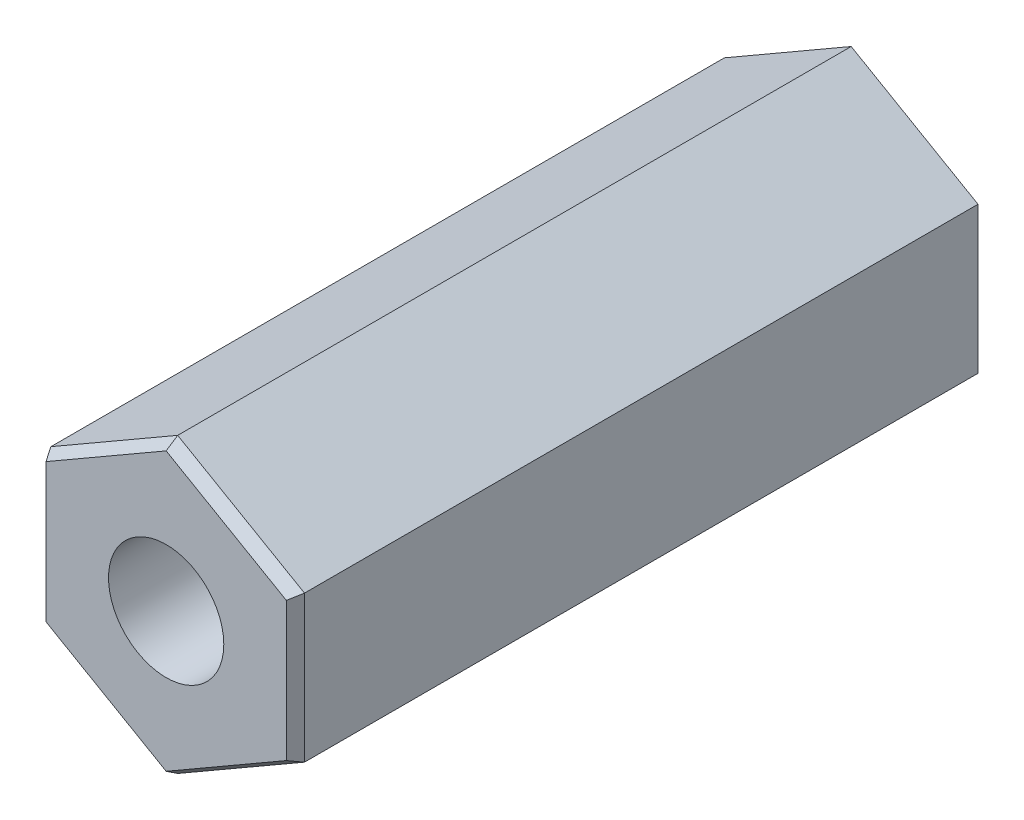
ISO-10303-21;
HEADER;
FILE_DESCRIPTION(('STEP AP214'),'2;1');
FILE_NAME('part.step','',(''),(''),'','','');
FILE_SCHEMA(('AUTOMOTIVE_DESIGN { 1 0 10303 214 1 1 1 1 }'));
ENDSEC;
DATA;
#1=APPLICATION_CONTEXT('core data for automotive mechanical design processes');
#2=APPLICATION_PROTOCOL_DEFINITION('international standard','automotive_design',2000,#1);
#3=PRODUCT_CONTEXT('',#1,'mechanical');
#4=PRODUCT('Part','Part','',(#3));
#5=PRODUCT_RELATED_PRODUCT_CATEGORY('part','',(#4));
#6=PRODUCT_DEFINITION_FORMATION('','',#4);
#7=PRODUCT_DEFINITION_CONTEXT('part definition',#1,'design');
#8=PRODUCT_DEFINITION('design','',#6,#7);
#9=PRODUCT_DEFINITION_SHAPE('','',#8);
#10=(LENGTH_UNIT() NAMED_UNIT(*) SI_UNIT(.MILLI.,.METRE.));
#11=(NAMED_UNIT(*) PLANE_ANGLE_UNIT() SI_UNIT($,.RADIAN.));
#12=(NAMED_UNIT(*) SI_UNIT($,.STERADIAN.) SOLID_ANGLE_UNIT());
#13=UNCERTAINTY_MEASURE_WITH_UNIT(LENGTH_MEASURE(1.E-05),#10,'distance_accuracy_value','');
#14=(GEOMETRIC_REPRESENTATION_CONTEXT(3) GLOBAL_UNCERTAINTY_ASSIGNED_CONTEXT((#13)) GLOBAL_UNIT_ASSIGNED_CONTEXT((#10,
#11,#12)) REPRESENTATION_CONTEXT('',''));
#15=CARTESIAN_POINT('',(0.,0.,0.));
#16=DIRECTION('',(0.,0.,1.));
#17=DIRECTION('',(1.,0.,0.));
#18=AXIS2_PLACEMENT_3D('',#15,#16,#17);
#19=CARTESIAN_POINT('',(0.,3.17542648054294,7.5));
#20=DIRECTION('',(0.500000000000001,-0.866025403784438,0.));
#21=DIRECTION('',(0.866025403784438,0.500000000000001,0.));
#22=AXIS2_PLACEMENT_3D('',#19,#20,#21);
#23=PLANE('',#22);
#24=DIRECTION('',(0.,0.,-1.));
#25=VECTOR('',#24,1.);
#26=CARTESIAN_POINT('',(-2.75,1.58771324027147,7.5));
#27=LINE('',#26,#25);
#28=CARTESIAN_POINT('',(-2.75,1.58771324027147,7.25));
#29=VERTEX_POINT('',#28);
#30=CARTESIAN_POINT('',(-2.75,1.58771324027147,-7.35566243270259));
#31=VERTEX_POINT('',#30);
#32=EDGE_CURVE('E147',#29,#31,#27,.T.);
#33=ORIENTED_EDGE('',*,*,#32,.F.);
#34=DIRECTION('',(0.866025403784438,0.500000000000001,0.));
#35=VECTOR('',#34,1.);
#36=CARTESIAN_POINT('',(0.,3.17542648054294,7.25));
#37=LINE('',#36,#35);
#38=CARTESIAN_POINT('',(0.,3.17542648054294,7.25));
#39=VERTEX_POINT('',#38);
#40=EDGE_CURVE('E134',#29,#39,#37,.T.);
#41=ORIENTED_EDGE('',*,*,#40,.T.);
#42=DIRECTION('',(0.,0.,-1.));
#43=VECTOR('',#42,1.);
#44=CARTESIAN_POINT('',(0.,3.17542648054294,7.5));
#45=LINE('',#44,#43);
#46=CARTESIAN_POINT('',(0.,3.17542648054294,-7.35566243270259));
#47=VERTEX_POINT('',#46);
#48=EDGE_CURVE('E251',#39,#47,#45,.T.);
#49=ORIENTED_EDGE('',*,*,#48,.T.);
#50=DIRECTION('',(-0.866025403784438,-0.500000000000001,0.));
#51=VECTOR('',#50,1.);
#52=CARTESIAN_POINT('',(0.,3.17542648054294,-7.35566243270259));
#53=LINE('',#52,#51);
#54=EDGE_CURVE('E154',#47,#31,#53,.T.);
#55=ORIENTED_EDGE('',*,*,#54,.T.);
#56=EDGE_LOOP('',(#33,#41,#49,#55));
#57=FACE_BOUND('',#56,.T.);
#58=ADVANCED_FACE('F36',(#57),#23,.F.);
#59=CARTESIAN_POINT('',(-2.75,1.58771324027147,7.5));
#60=DIRECTION('',(1.,0.,0.));
#61=DIRECTION('',(0.,0.,-1.));
#62=AXIS2_PLACEMENT_3D('',#59,#60,#61);
#63=PLANE('',#62);
#64=DIRECTION('',(0.,0.,-1.));
#65=VECTOR('',#64,1.);
#66=CARTESIAN_POINT('',(-2.75,-1.58771324027147,7.5));
#67=LINE('',#66,#65);
#68=CARTESIAN_POINT('',(-2.75,-1.58771324027147,7.25));
#69=VERTEX_POINT('',#68);
#70=CARTESIAN_POINT('',(-2.75,-1.58771324027147,-7.35566243270259));
#71=VERTEX_POINT('',#70);
#72=EDGE_CURVE('E261',#69,#71,#67,.T.);
#73=ORIENTED_EDGE('',*,*,#72,.F.);
#74=DIRECTION('',(0.,1.,0.));
#75=VECTOR('',#74,1.);
#76=CARTESIAN_POINT('',(-2.75,1.58771324027147,7.25));
#77=LINE('',#76,#75);
#78=EDGE_CURVE('E181',#69,#29,#77,.T.);
#79=ORIENTED_EDGE('',*,*,#78,.T.);
#80=ORIENTED_EDGE('',*,*,#32,.T.);
#81=DIRECTION('',(0.,-1.,0.));
#82=VECTOR('',#81,1.);
#83=CARTESIAN_POINT('',(-2.75,1.58771324027147,-7.35566243270259));
#84=LINE('',#83,#82);
#85=EDGE_CURVE('E179',#31,#71,#84,.T.);
#86=ORIENTED_EDGE('',*,*,#85,.T.);
#87=EDGE_LOOP('',(#73,#79,#80,#86));
#88=FACE_BOUND('',#87,.T.);
#89=ADVANCED_FACE('F280',(#88),#63,.F.);
#90=CARTESIAN_POINT('',(-2.75,-1.58771324027147,7.5));
#91=DIRECTION('',(0.5,0.866025403784439,0.));
#92=DIRECTION('',(-0.866025403784439,0.5,0.));
#93=AXIS2_PLACEMENT_3D('',#90,#91,#92);
#94=PLANE('',#93);
#95=DIRECTION('',(0.,0.,-1.));
#96=VECTOR('',#95,1.);
#97=CARTESIAN_POINT('',(0.,-3.17542648054294,7.5));
#98=LINE('',#97,#96);
#99=CARTESIAN_POINT('',(0.,-3.17542648054294,7.25));
#100=VERTEX_POINT('',#99);
#101=CARTESIAN_POINT('',(0.,-3.17542648054294,-7.35566243270259));
#102=VERTEX_POINT('',#101);
#103=EDGE_CURVE('E253',#100,#102,#98,.T.);
#104=ORIENTED_EDGE('',*,*,#103,.F.);
#105=DIRECTION('',(-0.866025403784439,0.5,0.));
#106=VECTOR('',#105,1.);
#107=CARTESIAN_POINT('',(-2.75,-1.58771324027147,7.25));
#108=LINE('',#107,#106);
#109=EDGE_CURVE('E177',#100,#69,#108,.T.);
#110=ORIENTED_EDGE('',*,*,#109,.T.);
#111=ORIENTED_EDGE('',*,*,#72,.T.);
#112=DIRECTION('',(0.866025403784439,-0.5,0.));
#113=VECTOR('',#112,1.);
#114=CARTESIAN_POINT('',(-2.75,-1.58771324027147,-7.35566243270259));
#115=LINE('',#114,#113);
#116=EDGE_CURVE('E175',#71,#102,#115,.T.);
#117=ORIENTED_EDGE('',*,*,#116,.T.);
#118=EDGE_LOOP('',(#104,#110,#111,#117));
#119=FACE_BOUND('',#118,.T.);
#120=ADVANCED_FACE('F292',(#119),#94,.F.);
#121=CARTESIAN_POINT('',(0.,-3.17542648054294,7.5));
#122=DIRECTION('',(-0.5,0.866025403784438,0.));
#123=DIRECTION('',(-0.866025403784438,-0.5,0.));
#124=AXIS2_PLACEMENT_3D('',#121,#122,#123);
#125=PLANE('',#124);
#126=DIRECTION('',(0.,0.,-1.));
#127=VECTOR('',#126,1.);
#128=CARTESIAN_POINT('',(2.75,-1.58771324027147,7.5));
#129=LINE('',#128,#127);
#130=CARTESIAN_POINT('',(2.75,-1.58771324027147,7.25));
#131=VERTEX_POINT('',#130);
#132=CARTESIAN_POINT('',(2.75,-1.58771324027147,-7.35566243270259));
#133=VERTEX_POINT('',#132);
#134=EDGE_CURVE('E245',#131,#133,#129,.T.);
#135=ORIENTED_EDGE('',*,*,#134,.F.);
#136=DIRECTION('',(-0.866025403784438,-0.5,0.));
#137=VECTOR('',#136,1.);
#138=CARTESIAN_POINT('',(0.,-3.17542648054294,7.25));
#139=LINE('',#138,#137);
#140=EDGE_CURVE('E173',#131,#100,#139,.T.);
#141=ORIENTED_EDGE('',*,*,#140,.T.);
#142=ORIENTED_EDGE('',*,*,#103,.T.);
#143=DIRECTION('',(0.866025403784438,0.5,0.));
#144=VECTOR('',#143,1.);
#145=CARTESIAN_POINT('',(0.,-3.17542648054294,-7.35566243270259));
#146=LINE('',#145,#144);
#147=EDGE_CURVE('E171',#102,#133,#146,.T.);
#148=ORIENTED_EDGE('',*,*,#147,.T.);
#149=EDGE_LOOP('',(#135,#141,#142,#148));
#150=FACE_BOUND('',#149,.T.);
#151=ADVANCED_FACE('F291',(#150),#125,.F.);
#152=CARTESIAN_POINT('',(2.75,-1.58771324027147,7.5));
#153=DIRECTION('',(-1.,0.,0.));
#154=DIRECTION('',(0.,-1.,0.));
#155=AXIS2_PLACEMENT_3D('',#152,#153,#154);
#156=PLANE('',#155);
#157=DIRECTION('',(0.,0.,-1.));
#158=VECTOR('',#157,1.);
#159=CARTESIAN_POINT('',(2.75,1.58771324027147,7.5));
#160=LINE('',#159,#158);
#161=CARTESIAN_POINT('',(2.75,1.58771324027147,7.25));
#162=VERTEX_POINT('',#161);
#163=CARTESIAN_POINT('',(2.75,1.58771324027147,-7.35566243270259));
#164=VERTEX_POINT('',#163);
#165=EDGE_CURVE('E242',#162,#164,#160,.T.);
#166=ORIENTED_EDGE('',*,*,#165,.F.);
#167=DIRECTION('',(0.,-1.,0.));
#168=VECTOR('',#167,1.);
#169=CARTESIAN_POINT('',(2.75,-1.58771324027147,7.25));
#170=LINE('',#169,#168);
#171=EDGE_CURVE('E169',#162,#131,#170,.T.);
#172=ORIENTED_EDGE('',*,*,#171,.T.);
#173=ORIENTED_EDGE('',*,*,#134,.T.);
#174=DIRECTION('',(0.,1.,0.));
#175=VECTOR('',#174,1.);
#176=CARTESIAN_POINT('',(2.75,-1.58771324027147,-7.35566243270259));
#177=LINE('',#176,#175);
#178=EDGE_CURVE('E166',#133,#164,#177,.T.);
#179=ORIENTED_EDGE('',*,*,#178,.T.);
#180=EDGE_LOOP('',(#166,#172,#173,#179));
#181=FACE_BOUND('',#180,.T.);
#182=ADVANCED_FACE('F241',(#181),#156,.F.);
#183=CARTESIAN_POINT('',(2.75,1.58771324027147,7.5));
#184=DIRECTION('',(-0.5,-0.866025403784439,0.));
#185=DIRECTION('',(0.866025403784439,-0.5,0.));
#186=AXIS2_PLACEMENT_3D('',#183,#184,#185);
#187=PLANE('',#186);
#188=ORIENTED_EDGE('',*,*,#48,.F.);
#189=DIRECTION('',(0.866025403784439,-0.5,0.));
#190=VECTOR('',#189,1.);
#191=CARTESIAN_POINT('',(2.75,1.58771324027147,7.25));
#192=LINE('',#191,#190);
#193=EDGE_CURVE('E164',#39,#162,#192,.T.);
#194=ORIENTED_EDGE('',*,*,#193,.T.);
#195=ORIENTED_EDGE('',*,*,#165,.T.);
#196=DIRECTION('',(-0.866025403784439,0.5,0.));
#197=VECTOR('',#196,1.);
#198=CARTESIAN_POINT('',(2.75,1.58771324027147,-7.35566243270259));
#199=LINE('',#198,#197);
#200=EDGE_CURVE('E162',#164,#47,#199,.T.);
#201=ORIENTED_EDGE('',*,*,#200,.T.);
#202=EDGE_LOOP('',(#188,#194,#195,#201));
#203=FACE_BOUND('',#202,.T.);
#204=ADVANCED_FACE('F248',(#203),#187,.F.);
#205=CARTESIAN_POINT('',(0.,0.,7.5));
#206=DIRECTION('',(0.,0.,1.));
#207=DIRECTION('',(1.,0.,0.));
#208=AXIS2_PLACEMENT_3D('',#205,#206,#207);
#209=PLANE('',#208);
#210=DIRECTION('',(-0.866025403784439,0.5,0.));
#211=VECTOR('',#210,1.);
#212=CARTESIAN_POINT('',(-0.0721687836487038,3.05042648054294,7.5));
#213=LINE('',#212,#211);
#214=CARTESIAN_POINT('',(2.60566243270259,1.50437990693814,7.5));
#215=VERTEX_POINT('',#214);
#216=CARTESIAN_POINT('',(0.,3.00875981387628,7.5));
#217=VERTEX_POINT('',#216);
#218=EDGE_CURVE('E152',#215,#217,#213,.T.);
#219=ORIENTED_EDGE('',*,*,#218,.T.);
#220=DIRECTION('',(-0.866025403784438,-0.500000000000001,0.));
#221=VECTOR('',#220,1.);
#222=CARTESIAN_POINT('',(-2.6778312163513,1.46271324027147,7.5));
#223=LINE('',#222,#221);
#224=CARTESIAN_POINT('',(-2.60566243270259,1.50437990693814,7.5));
#225=VERTEX_POINT('',#224);
#226=EDGE_CURVE('E132',#217,#225,#223,.T.);
#227=ORIENTED_EDGE('',*,*,#226,.T.);
#228=DIRECTION('',(0.,-1.,0.));
#229=VECTOR('',#228,1.);
#230=CARTESIAN_POINT('',(-2.60566243270259,-1.58771324027147,7.5));
#231=LINE('',#230,#229);
#232=CARTESIAN_POINT('',(-2.60566243270259,-1.50437990693814,7.5));
#233=VERTEX_POINT('',#232);
#234=EDGE_CURVE('E140',#225,#233,#231,.T.);
#235=ORIENTED_EDGE('',*,*,#234,.T.);
#236=DIRECTION('',(0.866025403784439,-0.5,0.));
#237=VECTOR('',#236,1.);
#238=CARTESIAN_POINT('',(0.072168783648703,-3.05042648054294,7.5));
#239=LINE('',#238,#237);
#240=CARTESIAN_POINT('',(0.,-3.00875981387628,7.5));
#241=VERTEX_POINT('',#240);
#242=EDGE_CURVE('E146',#233,#241,#239,.T.);
#243=ORIENTED_EDGE('',*,*,#242,.T.);
#244=DIRECTION('',(0.866025403784439,0.5,0.));
#245=VECTOR('',#244,1.);
#246=CARTESIAN_POINT('',(2.6778312163513,-1.46271324027147,7.5));
#247=LINE('',#246,#245);
#248=CARTESIAN_POINT('',(2.60566243270259,-1.50437990693814,7.5));
#249=VERTEX_POINT('',#248);
#250=EDGE_CURVE('E267',#241,#249,#247,.T.);
#251=ORIENTED_EDGE('',*,*,#250,.T.);
#252=DIRECTION('',(0.,1.,0.));
#253=VECTOR('',#252,1.);
#254=CARTESIAN_POINT('',(2.60566243270259,1.58771324027147,7.5));
#255=LINE('',#254,#253);
#256=EDGE_CURVE('E157',#249,#215,#255,.T.);
#257=ORIENTED_EDGE('',*,*,#256,.T.);
#258=EDGE_LOOP('',(#219,#227,#235,#243,#251,#257));
#259=FACE_BOUND('',#258,.T.);
#260=CARTESIAN_POINT('',(0.,0.,7.5));
#261=DIRECTION('',(0.,0.,1.));
#262=DIRECTION('',(1.,0.,0.));
#263=AXIS2_PLACEMENT_3D('',#260,#261,#262);
#264=CIRCLE('',#263,1.24999999999999);
#265=CARTESIAN_POINT('',(1.24999999999999,0.,7.5));
#266=VERTEX_POINT('',#265);
#267=EDGE_CURVE('E203',#266,#266,#264,.T.);
#268=ORIENTED_EDGE('',*,*,#267,.F.);
#269=EDGE_LOOP('',(#268));
#270=FACE_BOUND('',#269,.T.);
#271=ADVANCED_FACE('F149',(#259,#270),#209,.T.);
#272=CARTESIAN_POINT('',(0.,0.,-7.5));
#273=DIRECTION('',(0.,0.,1.));
#274=DIRECTION('',(1.,0.,0.));
#275=AXIS2_PLACEMENT_3D('',#272,#273,#274);
#276=PLANE('',#275);
#277=DIRECTION('',(0.866025403784439,-0.5,0.));
#278=VECTOR('',#277,1.);
#279=CARTESIAN_POINT('',(1.25,2.16506350946109,-7.5));
#280=LINE('',#279,#278);
#281=CARTESIAN_POINT('',(0.,2.88675134594812,-7.5));
#282=VERTEX_POINT('',#281);
#283=CARTESIAN_POINT('',(2.49999999999999,1.44337567297406,-7.5));
#284=VERTEX_POINT('',#283);
#285=EDGE_CURVE('E183',#282,#284,#280,.T.);
#286=ORIENTED_EDGE('',*,*,#285,.T.);
#287=DIRECTION('',(0.,-1.,0.));
#288=VECTOR('',#287,1.);
#289=CARTESIAN_POINT('',(2.5,0.,-7.5));
#290=LINE('',#289,#288);
#291=CARTESIAN_POINT('',(2.5,-1.44337567297406,-7.5));
#292=VERTEX_POINT('',#291);
#293=EDGE_CURVE('E11',#284,#292,#290,.T.);
#294=ORIENTED_EDGE('',*,*,#293,.T.);
#295=DIRECTION('',(-0.866025403784439,-0.5,0.));
#296=VECTOR('',#295,1.);
#297=CARTESIAN_POINT('',(1.25,-2.16506350946109,-7.5));
#298=LINE('',#297,#296);
#299=CARTESIAN_POINT('',(0.,-2.88675134594812,-7.5));
#300=VERTEX_POINT('',#299);
#301=EDGE_CURVE('E45',#292,#300,#298,.T.);
#302=ORIENTED_EDGE('',*,*,#301,.T.);
#303=DIRECTION('',(-0.866025403784439,0.5,0.));
#304=VECTOR('',#303,1.);
#305=CARTESIAN_POINT('',(-1.25,-2.16506350946109,-7.5));
#306=LINE('',#305,#304);
#307=CARTESIAN_POINT('',(-2.5,-1.44337567297406,-7.5));
#308=VERTEX_POINT('',#307);
#309=EDGE_CURVE('E189',#300,#308,#306,.T.);
#310=ORIENTED_EDGE('',*,*,#309,.T.);
#311=DIRECTION('',(0.,1.,0.));
#312=VECTOR('',#311,1.);
#313=CARTESIAN_POINT('',(-2.5,0.,-7.5));
#314=LINE('',#313,#312);
#315=CARTESIAN_POINT('',(-2.5,1.44337567297406,-7.5));
#316=VERTEX_POINT('',#315);
#317=EDGE_CURVE('E187',#308,#316,#314,.T.);
#318=ORIENTED_EDGE('',*,*,#317,.T.);
#319=DIRECTION('',(0.866025403784438,0.500000000000001,0.));
#320=VECTOR('',#319,1.);
#321=CARTESIAN_POINT('',(-1.25,2.16506350946109,-7.5));
#322=LINE('',#321,#320);
#323=EDGE_CURVE('E185',#316,#282,#322,.T.);
#324=ORIENTED_EDGE('',*,*,#323,.T.);
#325=EDGE_LOOP('',(#286,#294,#302,#310,#318,#324));
#326=FACE_BOUND('',#325,.T.);
#327=CARTESIAN_POINT('',(0.,0.,-7.5));
#328=DIRECTION('',(0.,0.,1.));
#329=DIRECTION('',(1.,0.,0.));
#330=AXIS2_PLACEMENT_3D('',#327,#328,#329);
#331=CIRCLE('',#330,1.25);
#332=CARTESIAN_POINT('',(1.25,0.,-7.5));
#333=VERTEX_POINT('',#332);
#334=EDGE_CURVE('E255',#333,#333,#331,.T.);
#335=ORIENTED_EDGE('',*,*,#334,.T.);
#336=EDGE_LOOP('',(#335));
#337=FACE_BOUND('',#336,.T.);
#338=ADVANCED_FACE('F227',(#326,#337),#276,.F.);
#339=CARTESIAN_POINT('',(0.,0.,7.5));
#340=DIRECTION('',(0.,0.,1.));
#341=DIRECTION('',(1.,0.,0.));
#342=AXIS2_PLACEMENT_3D('',#339,#340,#341);
#343=CYLINDRICAL_SURFACE('',#342,1.24999999999999);
#344=ORIENTED_EDGE('',*,*,#334,.F.);
#345=EDGE_LOOP('',(#344));
#346=FACE_BOUND('',#345,.T.);
#347=ORIENTED_EDGE('',*,*,#267,.T.);
#348=EDGE_LOOP('',(#347));
#349=FACE_BOUND('',#348,.T.);
#350=ADVANCED_FACE('F318',(#346,#349),#343,.F.);
#351=CARTESIAN_POINT('',(1.3028312163513,-2.25656986040721,7.5));
#352=DIRECTION('',(0.43301270189222,-0.75,0.5));
#353=DIRECTION('',(-0.866025403784438,-0.5,0.));
#354=AXIS2_PLACEMENT_3D('',#351,#352,#353);
#355=PLANE('',#354);
#356=DIRECTION('',(0.,0.554700196225229,0.832050294337843));
#357=VECTOR('',#356,1.);
#358=CARTESIAN_POINT('',(0.,-2.77731675127041,7.8471645939088));
#359=LINE('',#358,#357);
#360=EDGE_CURVE('E197',#100,#241,#359,.T.);
#361=ORIENTED_EDGE('',*,*,#360,.F.);
#362=ORIENTED_EDGE('',*,*,#140,.F.);
#363=DIRECTION('',(-0.480384461415261,0.277350098112614,0.832050294337844));
#364=VECTOR('',#363,1.);
#365=CARTESIAN_POINT('',(2.40522686095624,-1.3886583756352,7.8471645939088));
#366=LINE('',#365,#364);
#367=EDGE_CURVE('E200',#249,#131,#366,.F.);
#368=ORIENTED_EDGE('',*,*,#367,.F.);
#369=ORIENTED_EDGE('',*,*,#250,.F.);
#370=EDGE_LOOP('',(#361,#362,#368,#369));
#371=FACE_BOUND('',#370,.T.);
#372=ADVANCED_FACE('F287',(#371),#355,.T.);
#373=CARTESIAN_POINT('',(2.60566243270259,0.,7.5));
#374=DIRECTION('',(0.866025403784439,0.,0.5));
#375=DIRECTION('',(0.,-1.,0.));
#376=AXIS2_PLACEMENT_3D('',#373,#374,#375);
#377=PLANE('',#376);
#378=ORIENTED_EDGE('',*,*,#367,.T.);
#379=ORIENTED_EDGE('',*,*,#171,.F.);
#380=DIRECTION('',(-0.480384461415261,-0.277350098112615,0.832050294337843));
#381=VECTOR('',#380,1.);
#382=CARTESIAN_POINT('',(2.40522686095624,1.3886583756352,7.8471645939088));
#383=LINE('',#382,#381);
#384=EDGE_CURVE('E194',#215,#162,#383,.F.);
#385=ORIENTED_EDGE('',*,*,#384,.F.);
#386=ORIENTED_EDGE('',*,*,#256,.F.);
#387=EDGE_LOOP('',(#378,#379,#385,#386));
#388=FACE_BOUND('',#387,.T.);
#389=ADVANCED_FACE('F273',(#388),#377,.T.);
#390=CARTESIAN_POINT('',(-1.3028312163513,-2.25656986040721,7.5));
#391=DIRECTION('',(-0.433012701892219,-0.75,0.5));
#392=DIRECTION('',(-0.866025403784439,0.5,0.));
#393=AXIS2_PLACEMENT_3D('',#390,#391,#392);
#394=PLANE('',#393);
#395=ORIENTED_EDGE('',*,*,#360,.T.);
#396=ORIENTED_EDGE('',*,*,#242,.F.);
#397=DIRECTION('',(0.480384461415261,0.277350098112615,0.832050294337843));
#398=VECTOR('',#397,1.);
#399=CARTESIAN_POINT('',(-2.40522686095624,-1.3886583756352,7.8471645939088));
#400=LINE('',#399,#398);
#401=EDGE_CURVE('E143',#69,#233,#400,.T.);
#402=ORIENTED_EDGE('',*,*,#401,.F.);
#403=ORIENTED_EDGE('',*,*,#109,.F.);
#404=EDGE_LOOP('',(#395,#396,#402,#403));
#405=FACE_BOUND('',#404,.T.);
#406=ADVANCED_FACE('F284',(#405),#394,.T.);
#407=CARTESIAN_POINT('',(1.3028312163513,2.25656986040721,7.5));
#408=DIRECTION('',(0.433012701892219,0.75,0.5));
#409=DIRECTION('',(0.866025403784439,-0.5,0.));
#410=AXIS2_PLACEMENT_3D('',#407,#408,#409);
#411=PLANE('',#410);
#412=ORIENTED_EDGE('',*,*,#384,.T.);
#413=ORIENTED_EDGE('',*,*,#193,.F.);
#414=DIRECTION('',(0.,-0.554700196225229,0.832050294337843));
#415=VECTOR('',#414,1.);
#416=CARTESIAN_POINT('',(0.,2.77731675127041,7.8471645939088));
#417=LINE('',#416,#415);
#418=EDGE_CURVE('E137',#217,#39,#417,.F.);
#419=ORIENTED_EDGE('',*,*,#418,.F.);
#420=ORIENTED_EDGE('',*,*,#218,.F.);
#421=EDGE_LOOP('',(#412,#413,#419,#420));
#422=FACE_BOUND('',#421,.T.);
#423=ADVANCED_FACE('F275',(#422),#411,.T.);
#424=CARTESIAN_POINT('',(-2.60566243270259,0.,7.5));
#425=DIRECTION('',(-0.866025403784439,0.,0.5));
#426=DIRECTION('',(0.,1.,0.));
#427=AXIS2_PLACEMENT_3D('',#424,#425,#426);
#428=PLANE('',#427);
#429=ORIENTED_EDGE('',*,*,#401,.T.);
#430=ORIENTED_EDGE('',*,*,#234,.F.);
#431=DIRECTION('',(-0.480384461415261,0.277350098112615,-0.832050294337844));
#432=VECTOR('',#431,1.);
#433=CARTESIAN_POINT('',(-2.40522686095624,1.3886583756352,7.8471645939088));
#434=LINE('',#433,#432);
#435=EDGE_CURVE('E128',#29,#225,#434,.F.);
#436=ORIENTED_EDGE('',*,*,#435,.F.);
#437=ORIENTED_EDGE('',*,*,#78,.F.);
#438=EDGE_LOOP('',(#429,#430,#436,#437));
#439=FACE_BOUND('',#438,.T.);
#440=ADVANCED_FACE('F141',(#439),#428,.T.);
#441=CARTESIAN_POINT('',(-1.3028312163513,2.2565698604072,7.5));
#442=DIRECTION('',(-0.43301270189222,0.749999999999999,0.5));
#443=DIRECTION('',(0.866025403784438,0.500000000000001,0.));
#444=AXIS2_PLACEMENT_3D('',#441,#442,#443);
#445=PLANE('',#444);
#446=ORIENTED_EDGE('',*,*,#418,.T.);
#447=ORIENTED_EDGE('',*,*,#40,.F.);
#448=ORIENTED_EDGE('',*,*,#435,.T.);
#449=ORIENTED_EDGE('',*,*,#226,.F.);
#450=EDGE_LOOP('',(#446,#447,#448,#449));
#451=FACE_BOUND('',#450,.T.);
#452=ADVANCED_FACE('F130',(#451),#445,.T.);
#453=CARTESIAN_POINT('',(-2.75,1.58771324027147,-7.35566243270259));
#454=DIRECTION('',(0.499999999999997,0.,0.86602540378444));
#455=DIRECTION('',(0.,-1.,0.));
#456=AXIS2_PLACEMENT_3D('',#453,#454,#455);
#457=PLANE('',#456);
#458=DIRECTION('',(-0.774596669241485,0.447213595499958,0.447213595499956));
#459=VECTOR('',#458,1.);
#460=CARTESIAN_POINT('',(-1.65,0.952627944162879,-7.99074772881118));
#461=LINE('',#460,#459);
#462=EDGE_CURVE('E212',#316,#31,#461,.T.);
#463=ORIENTED_EDGE('',*,*,#462,.F.);
#464=ORIENTED_EDGE('',*,*,#317,.F.);
#465=DIRECTION('',(-0.774596669241485,-0.447213595499957,0.447213595499956));
#466=VECTOR('',#465,1.);
#467=CARTESIAN_POINT('',(-1.65,-0.952627944162886,-7.99074772881118));
#468=LINE('',#467,#466);
#469=EDGE_CURVE('E40',#71,#308,#468,.F.);
#470=ORIENTED_EDGE('',*,*,#469,.F.);
#471=ORIENTED_EDGE('',*,*,#85,.F.);
#472=EDGE_LOOP('',(#463,#464,#470,#471));
#473=FACE_BOUND('',#472,.T.);
#474=ADVANCED_FACE('F38',(#473),#457,.F.);
#475=CARTESIAN_POINT('',(-2.75,-1.58771324027147,-7.35566243270259));
#476=DIRECTION('',(0.249999999999999,0.433012701892218,0.86602540378444));
#477=DIRECTION('',(0.866025403784439,-0.5,0.));
#478=AXIS2_PLACEMENT_3D('',#475,#476,#477);
#479=PLANE('',#478);
#480=ORIENTED_EDGE('',*,*,#469,.T.);
#481=ORIENTED_EDGE('',*,*,#309,.F.);
#482=DIRECTION('',(0.,-0.894427190999917,0.447213595499956));
#483=VECTOR('',#482,1.);
#484=CARTESIAN_POINT('',(0.,-1.90525588832576,-7.99074772881118));
#485=LINE('',#484,#483);
#486=EDGE_CURVE('E210',#102,#300,#485,.F.);
#487=ORIENTED_EDGE('',*,*,#486,.F.);
#488=ORIENTED_EDGE('',*,*,#116,.F.);
#489=EDGE_LOOP('',(#480,#481,#487,#488));
#490=FACE_BOUND('',#489,.T.);
#491=ADVANCED_FACE('F222',(#490),#479,.F.);
#492=CARTESIAN_POINT('',(0.,3.17542648054294,-7.35566243270259));
#493=DIRECTION('',(0.249999999999999,-0.433012701892217,0.86602540378444));
#494=DIRECTION('',(-0.866025403784438,-0.500000000000001,0.));
#495=AXIS2_PLACEMENT_3D('',#492,#493,#494);
#496=PLANE('',#495);
#497=ORIENTED_EDGE('',*,*,#462,.T.);
#498=ORIENTED_EDGE('',*,*,#54,.F.);
#499=DIRECTION('',(0.,0.894427190999917,0.447213595499956));
#500=VECTOR('',#499,1.);
#501=CARTESIAN_POINT('',(0.,1.90525588832576,-7.99074772881118));
#502=LINE('',#501,#500);
#503=EDGE_CURVE('E207',#282,#47,#502,.T.);
#504=ORIENTED_EDGE('',*,*,#503,.F.);
#505=ORIENTED_EDGE('',*,*,#323,.F.);
#506=EDGE_LOOP('',(#497,#498,#504,#505));
#507=FACE_BOUND('',#506,.T.);
#508=ADVANCED_FACE('F231',(#507),#496,.F.);
#509=CARTESIAN_POINT('',(0.,-3.17542648054294,-7.35566243270259));
#510=DIRECTION('',(-0.249999999999999,0.433012701892218,0.86602540378444));
#511=DIRECTION('',(0.866025403784438,0.5,0.));
#512=AXIS2_PLACEMENT_3D('',#509,#510,#511);
#513=PLANE('',#512);
#514=ORIENTED_EDGE('',*,*,#486,.T.);
#515=ORIENTED_EDGE('',*,*,#301,.F.);
#516=DIRECTION('',(0.774596669241486,-0.447213595499956,0.447213595499956));
#517=VECTOR('',#516,1.);
#518=CARTESIAN_POINT('',(1.64999999999999,-0.952627944162879,-7.99074772881118));
#519=LINE('',#518,#517);
#520=EDGE_CURVE('E53',#133,#292,#519,.F.);
#521=ORIENTED_EDGE('',*,*,#520,.F.);
#522=ORIENTED_EDGE('',*,*,#147,.F.);
#523=EDGE_LOOP('',(#514,#515,#521,#522));
#524=FACE_BOUND('',#523,.T.);
#525=ADVANCED_FACE('F323',(#524),#513,.F.);
#526=CARTESIAN_POINT('',(2.75,1.58771324027147,-7.35566243270259));
#527=DIRECTION('',(-0.249999999999999,-0.433012701892218,0.86602540378444));
#528=DIRECTION('',(-0.866025403784439,0.5,0.));
#529=AXIS2_PLACEMENT_3D('',#526,#527,#528);
#530=PLANE('',#529);
#531=ORIENTED_EDGE('',*,*,#503,.T.);
#532=ORIENTED_EDGE('',*,*,#200,.F.);
#533=DIRECTION('',(-0.774596669241485,-0.447213595499957,-0.447213595499956));
#534=VECTOR('',#533,1.);
#535=CARTESIAN_POINT('',(2.75,1.58771324027147,-7.35566243270259));
#536=LINE('',#535,#534);
#537=EDGE_CURVE('E204',#284,#164,#536,.F.);
#538=ORIENTED_EDGE('',*,*,#537,.F.);
#539=ORIENTED_EDGE('',*,*,#285,.F.);
#540=EDGE_LOOP('',(#531,#532,#538,#539));
#541=FACE_BOUND('',#540,.T.);
#542=ADVANCED_FACE('F235',(#541),#530,.F.);
#543=CARTESIAN_POINT('',(2.75,-1.58771324027147,-7.35566243270259));
#544=DIRECTION('',(-0.499999999999997,0.,0.86602540378444));
#545=DIRECTION('',(0.,1.,0.));
#546=AXIS2_PLACEMENT_3D('',#543,#544,#545);
#547=PLANE('',#546);
#548=ORIENTED_EDGE('',*,*,#520,.T.);
#549=ORIENTED_EDGE('',*,*,#293,.F.);
#550=ORIENTED_EDGE('',*,*,#537,.T.);
#551=ORIENTED_EDGE('',*,*,#178,.F.);
#552=EDGE_LOOP('',(#548,#549,#550,#551));
#553=FACE_BOUND('',#552,.T.);
#554=ADVANCED_FACE('F236',(#553),#547,.F.);
#555=CLOSED_SHELL('',(#58,#89,#120,#151,#182,#204,#271,#338,#350,#372,#389,#406,#423,#440,#452,
#474,#491,#508,#525,#542,#554));
#556=MANIFOLD_SOLID_BREP('B2',#555);
#557=ADVANCED_BREP_SHAPE_REPRESENTATION('',(#18,#556),#14);
#558=SHAPE_DEFINITION_REPRESENTATION(#9,#557);
ENDSEC;
END-ISO-10303-21;
